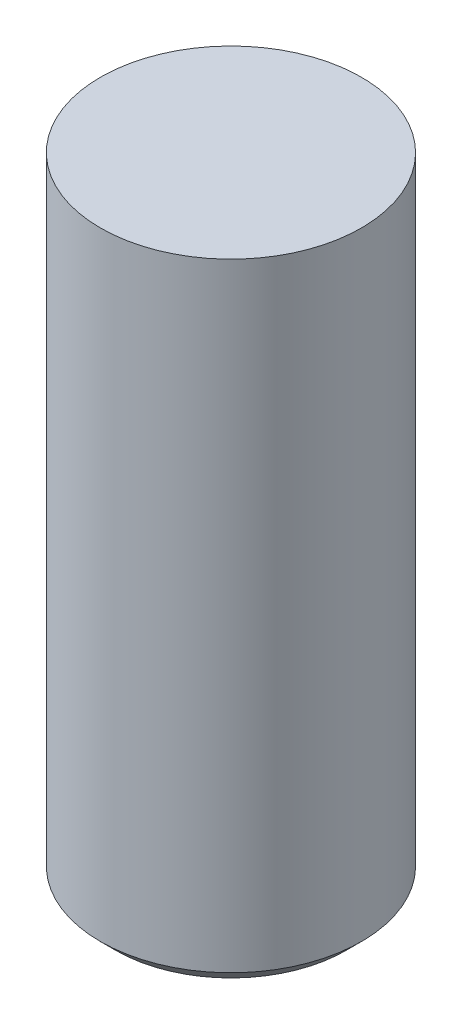
ISO-10303-21;
HEADER;
FILE_DESCRIPTION(('STEP AP214'),'2;1');
FILE_NAME('part.step','',(''),(''),'','','');
FILE_SCHEMA(('AUTOMOTIVE_DESIGN { 1 0 10303 214 1 1 1 1 }'));
ENDSEC;
DATA;
#1=APPLICATION_CONTEXT('core data for automotive mechanical design processes');
#2=APPLICATION_PROTOCOL_DEFINITION('international standard','automotive_design',2000,#1);
#3=PRODUCT_CONTEXT('',#1,'mechanical');
#4=PRODUCT('Part','Part','',(#3));
#5=PRODUCT_RELATED_PRODUCT_CATEGORY('part','',(#4));
#6=PRODUCT_DEFINITION_FORMATION('','',#4);
#7=PRODUCT_DEFINITION_CONTEXT('part definition',#1,'design');
#8=PRODUCT_DEFINITION('design','',#6,#7);
#9=PRODUCT_DEFINITION_SHAPE('','',#8);
#10=(LENGTH_UNIT() NAMED_UNIT(*) SI_UNIT(.MILLI.,.METRE.));
#11=(NAMED_UNIT(*) PLANE_ANGLE_UNIT() SI_UNIT($,.RADIAN.));
#12=(NAMED_UNIT(*) SI_UNIT($,.STERADIAN.) SOLID_ANGLE_UNIT());
#13=UNCERTAINTY_MEASURE_WITH_UNIT(LENGTH_MEASURE(1.E-05),#10,'distance_accuracy_value','');
#14=(GEOMETRIC_REPRESENTATION_CONTEXT(3) GLOBAL_UNCERTAINTY_ASSIGNED_CONTEXT((#13)) GLOBAL_UNIT_ASSIGNED_CONTEXT((#10,
#11,#12)) REPRESENTATION_CONTEXT('',''));
#15=CARTESIAN_POINT('',(0.,0.,0.));
#16=DIRECTION('',(0.,0.,1.));
#17=DIRECTION('',(1.,0.,0.));
#18=AXIS2_PLACEMENT_3D('',#15,#16,#17);
#19=CARTESIAN_POINT('',(0.,41.,0.));
#20=DIRECTION('',(0.,-1.,0.));
#21=DIRECTION('',(0.,0.,-1.));
#22=AXIS2_PLACEMENT_3D('',#19,#20,#21);
#23=CYLINDRICAL_SURFACE('',#22,16.9);
#24=CARTESIAN_POINT('',(0.,-39.,0.));
#25=DIRECTION('',(0.,1.,0.));
#26=DIRECTION('',(0.,0.,1.));
#27=AXIS2_PLACEMENT_3D('',#24,#25,#26);
#28=CIRCLE('',#27,16.9);
#29=CARTESIAN_POINT('',(0.,-39.,16.9));
#30=VERTEX_POINT('',#29);
#31=EDGE_CURVE('E54',#30,#30,#28,.T.);
#32=ORIENTED_EDGE('',*,*,#31,.T.);
#33=EDGE_LOOP('',(#32));
#34=FACE_BOUND('',#33,.T.);
#35=CARTESIAN_POINT('',(0.,41.,0.));
#36=DIRECTION('',(0.,1.,0.));
#37=DIRECTION('',(0.,0.,1.));
#38=AXIS2_PLACEMENT_3D('',#35,#36,#37);
#39=CIRCLE('',#38,16.9);
#40=CARTESIAN_POINT('',(0.,41.,16.9));
#41=VERTEX_POINT('',#40);
#42=EDGE_CURVE('E59',#41,#41,#39,.T.);
#43=ORIENTED_EDGE('',*,*,#42,.F.);
#44=EDGE_LOOP('',(#43));
#45=FACE_BOUND('',#44,.T.);
#46=ADVANCED_FACE('F45',(#34,#45),#23,.T.);
#47=CARTESIAN_POINT('',(0.,41.,0.));
#48=DIRECTION('',(0.,1.,0.));
#49=DIRECTION('',(0.,0.,1.));
#50=AXIS2_PLACEMENT_3D('',#47,#48,#49);
#51=PLANE('',#50);
#52=ORIENTED_EDGE('',*,*,#42,.T.);
#53=EDGE_LOOP('',(#52));
#54=FACE_BOUND('',#53,.T.);
#55=ADVANCED_FACE('F67',(#54),#51,.T.);
#56=CARTESIAN_POINT('',(0.,-41.,0.));
#57=DIRECTION('',(0.,1.,0.));
#58=DIRECTION('',(0.,0.,1.));
#59=AXIS2_PLACEMENT_3D('',#56,#57,#58);
#60=PLANE('',#59);
#61=CARTESIAN_POINT('',(0.,-41.,0.));
#62=DIRECTION('',(0.,1.,0.));
#63=DIRECTION('',(0.,0.,1.));
#64=AXIS2_PLACEMENT_3D('',#61,#62,#63);
#65=CIRCLE('',#64,14.9);
#66=CARTESIAN_POINT('',(0.,-41.,14.9));
#67=VERTEX_POINT('',#66);
#68=EDGE_CURVE('E10',#67,#67,#65,.F.);
#69=ORIENTED_EDGE('',*,*,#68,.T.);
#70=EDGE_LOOP('',(#69));
#71=FACE_BOUND('',#70,.T.);
#72=ADVANCED_FACE('F73',(#71),#60,.F.);
#73=CARTESIAN_POINT('',(0.,-39.,0.));
#74=DIRECTION('',(0.,1.,0.));
#75=DIRECTION('',(0.,0.,1.));
#76=AXIS2_PLACEMENT_3D('',#73,#74,#75);
#77=CONICAL_SURFACE('',#76,16.9,0.78539816339745);
#78=ORIENTED_EDGE('',*,*,#68,.F.);
#79=EDGE_LOOP('',(#78));
#80=FACE_BOUND('',#79,.T.);
#81=ORIENTED_EDGE('',*,*,#31,.F.);
#82=EDGE_LOOP('',(#81));
#83=FACE_BOUND('',#82,.T.);
#84=ADVANCED_FACE('F48',(#80,#83),#77,.T.);
#85=CLOSED_SHELL('',(#46,#55,#72,#84));
#86=MANIFOLD_SOLID_BREP('B2',#85);
#87=ADVANCED_BREP_SHAPE_REPRESENTATION('',(#18,#86),#14);
#88=SHAPE_DEFINITION_REPRESENTATION(#9,#87);
ENDSEC;
END-ISO-10303-21;
